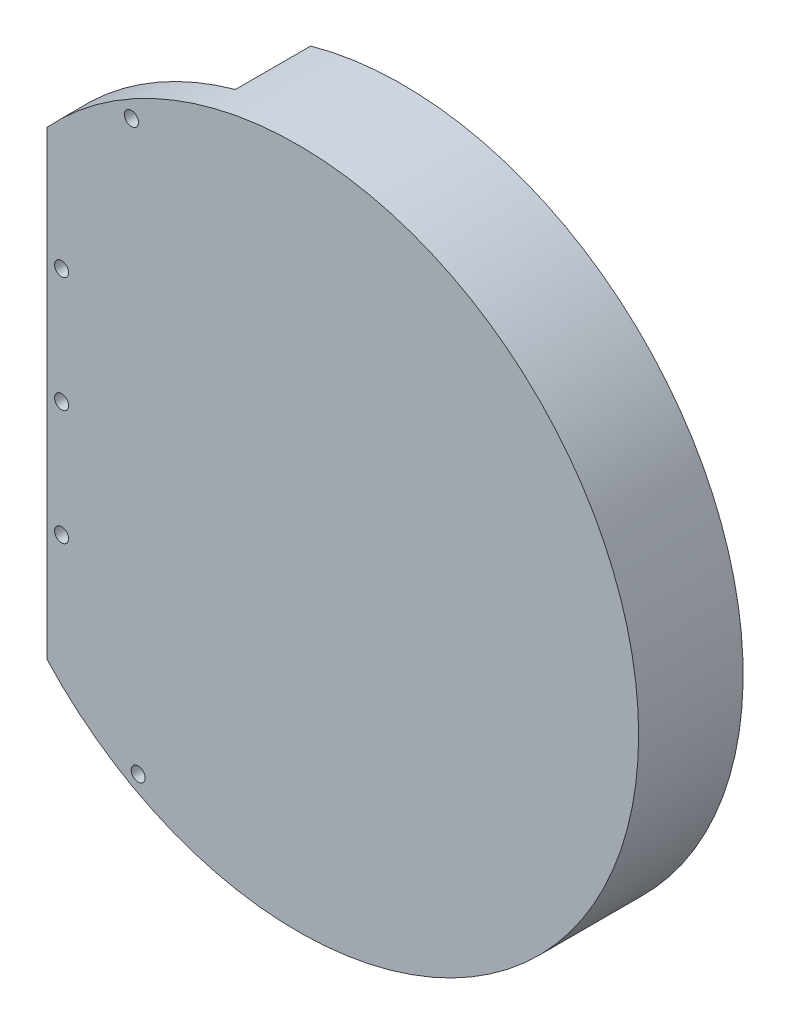
ISO-10303-21;
HEADER;
FILE_DESCRIPTION(('STEP AP214'),'2;1');
FILE_NAME('part.step','',(''),(''),'','','');
FILE_SCHEMA(('AUTOMOTIVE_DESIGN { 1 0 10303 214 1 1 1 1 }'));
ENDSEC;
DATA;
#1=APPLICATION_CONTEXT('core data for automotive mechanical design processes');
#2=APPLICATION_PROTOCOL_DEFINITION('international standard','automotive_design',2000,#1);
#3=PRODUCT_CONTEXT('',#1,'mechanical');
#4=PRODUCT('Part','Part','',(#3));
#5=PRODUCT_RELATED_PRODUCT_CATEGORY('part','',(#4));
#6=PRODUCT_DEFINITION_FORMATION('','',#4);
#7=PRODUCT_DEFINITION_CONTEXT('part definition',#1,'design');
#8=PRODUCT_DEFINITION('design','',#6,#7);
#9=PRODUCT_DEFINITION_SHAPE('','',#8);
#10=(LENGTH_UNIT() NAMED_UNIT(*) SI_UNIT(.MILLI.,.METRE.));
#11=(NAMED_UNIT(*) PLANE_ANGLE_UNIT() SI_UNIT($,.RADIAN.));
#12=(NAMED_UNIT(*) SI_UNIT($,.STERADIAN.) SOLID_ANGLE_UNIT());
#13=UNCERTAINTY_MEASURE_WITH_UNIT(LENGTH_MEASURE(1.E-05),#10,'distance_accuracy_value','');
#14=(GEOMETRIC_REPRESENTATION_CONTEXT(3) GLOBAL_UNCERTAINTY_ASSIGNED_CONTEXT((#13)) GLOBAL_UNIT_ASSIGNED_CONTEXT((#10,
#11,#12)) REPRESENTATION_CONTEXT('',''));
#15=CARTESIAN_POINT('',(0.,0.,0.));
#16=DIRECTION('',(0.,0.,1.));
#17=DIRECTION('',(1.,0.,0.));
#18=AXIS2_PLACEMENT_3D('',#15,#16,#17);
#19=CARTESIAN_POINT('',(42.9355150351706,0.,5.));
#20=DIRECTION('',(0.,0.,-1.));
#21=DIRECTION('',(-1.,0.,0.));
#22=AXIS2_PLACEMENT_3D('',#19,#20,#21);
#23=CYLINDRICAL_SURFACE('',#22,58.2854849648294);
#24=CARTESIAN_POINT('',(42.9355150351706,0.,0.));
#25=DIRECTION('',(0.,0.,1.));
#26=DIRECTION('',(-1.,0.,0.));
#27=AXIS2_PLACEMENT_3D('',#24,#25,#26);
#28=CIRCLE('',#27,58.2854849648294);
#29=CARTESIAN_POINT('',(0.,-39.4175,0.));
#30=VERTEX_POINT('',#29);
#31=CARTESIAN_POINT('',(27.955,-56.32745269286,0.));
#32=VERTEX_POINT('',#31);
#33=EDGE_CURVE('E155',#30,#32,#28,.T.);
#34=ORIENTED_EDGE('',*,*,#33,.T.);
#35=DIRECTION('',(0.,0.,1.));
#36=VECTOR('',#35,1.);
#37=CARTESIAN_POINT('',(27.955,-56.32745269286,-12.879));
#38=LINE('',#37,#36);
#39=CARTESIAN_POINT('',(27.955,-56.32745269286,-12.879));
#40=VERTEX_POINT('',#39);
#41=EDGE_CURVE('E100',#40,#32,#38,.T.);
#42=ORIENTED_EDGE('',*,*,#41,.F.);
#43=CARTESIAN_POINT('',(42.9355150351706,0.,-12.879));
#44=DIRECTION('',(0.,0.,-1.));
#45=DIRECTION('',(-1.,0.,0.));
#46=AXIS2_PLACEMENT_3D('',#43,#44,#45);
#47=CIRCLE('',#46,58.2854849648294);
#48=CARTESIAN_POINT('',(27.2366145278737,56.1314731718966,-12.879));
#49=VERTEX_POINT('',#48);
#50=EDGE_CURVE('E90',#49,#40,#47,.T.);
#51=ORIENTED_EDGE('',*,*,#50,.F.);
#52=DIRECTION('',(0.,0.,1.));
#53=VECTOR('',#52,1.);
#54=CARTESIAN_POINT('',(27.2366145278737,56.1314731718966,-12.879));
#55=LINE('',#54,#53);
#56=CARTESIAN_POINT('',(27.2366145278737,56.1314731718966,0.));
#57=VERTEX_POINT('',#56);
#58=EDGE_CURVE('E115',#49,#57,#55,.T.);
#59=ORIENTED_EDGE('',*,*,#58,.T.);
#60=CARTESIAN_POINT('',(0.,39.4175,0.));
#61=VERTEX_POINT('',#60);
#62=EDGE_CURVE('E146',#57,#61,#28,.T.);
#63=ORIENTED_EDGE('',*,*,#62,.T.);
#64=DIRECTION('',(0.,0.,-1.));
#65=VECTOR('',#64,1.);
#66=CARTESIAN_POINT('',(0.,39.4175,5.));
#67=LINE('',#66,#65);
#68=CARTESIAN_POINT('',(0.,39.4175,5.));
#69=VERTEX_POINT('',#68);
#70=EDGE_CURVE('E11',#69,#61,#67,.T.);
#71=ORIENTED_EDGE('',*,*,#70,.F.);
#72=CARTESIAN_POINT('',(42.9355150351706,0.,5.));
#73=DIRECTION('',(0.,0.,1.));
#74=DIRECTION('',(-1.,0.,0.));
#75=AXIS2_PLACEMENT_3D('',#72,#73,#74);
#76=CIRCLE('',#75,58.2854849648294);
#77=CARTESIAN_POINT('',(0.,-39.4175,5.));
#78=VERTEX_POINT('',#77);
#79=EDGE_CURVE('E149',#78,#69,#76,.T.);
#80=ORIENTED_EDGE('',*,*,#79,.F.);
#81=DIRECTION('',(0.,0.,-1.));
#82=VECTOR('',#81,1.);
#83=CARTESIAN_POINT('',(0.,-39.4175,5.));
#84=LINE('',#83,#82);
#85=EDGE_CURVE('E40',#78,#30,#84,.T.);
#86=ORIENTED_EDGE('',*,*,#85,.T.);
#87=EDGE_LOOP('',(#34,#42,#51,#59,#63,#71,#80,#86));
#88=FACE_BOUND('',#87,.T.);
#89=ADVANCED_FACE('F33',(#88),#23,.T.);
#90=CARTESIAN_POINT('',(0.,-39.4175,5.));
#91=DIRECTION('',(1.,0.,0.));
#92=DIRECTION('',(0.,1.,0.));
#93=AXIS2_PLACEMENT_3D('',#90,#91,#92);
#94=PLANE('',#93);
#95=DIRECTION('',(0.,-1.,0.));
#96=VECTOR('',#95,1.);
#97=CARTESIAN_POINT('',(0.,-39.4175,0.));
#98=LINE('',#97,#96);
#99=EDGE_CURVE('E153',#61,#30,#98,.T.);
#100=ORIENTED_EDGE('',*,*,#99,.T.);
#101=ORIENTED_EDGE('',*,*,#85,.F.);
#102=DIRECTION('',(0.,-1.,0.));
#103=VECTOR('',#102,1.);
#104=CARTESIAN_POINT('',(0.,-39.4175,5.));
#105=LINE('',#104,#103);
#106=EDGE_CURVE('E152',#69,#78,#105,.T.);
#107=ORIENTED_EDGE('',*,*,#106,.F.);
#108=ORIENTED_EDGE('',*,*,#70,.T.);
#109=EDGE_LOOP('',(#100,#101,#107,#108));
#110=FACE_BOUND('',#109,.T.);
#111=ADVANCED_FACE('F168',(#110),#94,.F.);
#112=CARTESIAN_POINT('',(42.9355150351706,0.,5.));
#113=DIRECTION('',(0.,0.,-1.));
#114=DIRECTION('',(-1.,0.,0.));
#115=AXIS2_PLACEMENT_3D('',#112,#113,#114);
#116=PLANE('',#115);
#117=CARTESIAN_POINT('',(14.4503829734086,47.941684776241,5.));
#118=DIRECTION('',(0.,0.,1.));
#119=DIRECTION('',(1.,0.,0.));
#120=AXIS2_PLACEMENT_3D('',#117,#118,#119);
#121=CIRCLE('',#120,1.20000000000001);
#122=CARTESIAN_POINT('',(15.6503829734086,47.941684776241,5.));
#123=VERTEX_POINT('',#122);
#124=EDGE_CURVE('E114',#123,#123,#121,.T.);
#125=ORIENTED_EDGE('',*,*,#124,.F.);
#126=EDGE_LOOP('',(#125));
#127=FACE_BOUND('',#126,.T.);
#128=CARTESIAN_POINT('',(15.6030670012185,-48.6104558619186,5.));
#129=DIRECTION('',(0.,0.,1.));
#130=DIRECTION('',(1.,0.,0.));
#131=AXIS2_PLACEMENT_3D('',#128,#129,#130);
#132=CIRCLE('',#131,1.2);
#133=CARTESIAN_POINT('',(16.8030670012185,-48.6104558619186,5.));
#134=VERTEX_POINT('',#133);
#135=EDGE_CURVE('E135',#134,#134,#132,.T.);
#136=ORIENTED_EDGE('',*,*,#135,.F.);
#137=EDGE_LOOP('',(#136));
#138=FACE_BOUND('',#137,.T.);
#139=CARTESIAN_POINT('',(2.5,-19.70875,5.));
#140=DIRECTION('',(0.,0.,1.));
#141=DIRECTION('',(1.,0.,0.));
#142=AXIS2_PLACEMENT_3D('',#139,#140,#141);
#143=CIRCLE('',#142,1.2);
#144=CARTESIAN_POINT('',(3.7,-19.70875,5.));
#145=VERTEX_POINT('',#144);
#146=EDGE_CURVE('E129',#145,#145,#143,.T.);
#147=ORIENTED_EDGE('',*,*,#146,.F.);
#148=EDGE_LOOP('',(#147));
#149=FACE_BOUND('',#148,.T.);
#150=CARTESIAN_POINT('',(2.5,0.,5.));
#151=DIRECTION('',(0.,0.,1.));
#152=DIRECTION('',(1.,0.,0.));
#153=AXIS2_PLACEMENT_3D('',#150,#151,#152);
#154=CIRCLE('',#153,1.2);
#155=CARTESIAN_POINT('',(3.7,0.,5.));
#156=VERTEX_POINT('',#155);
#157=EDGE_CURVE('E123',#156,#156,#154,.T.);
#158=ORIENTED_EDGE('',*,*,#157,.F.);
#159=EDGE_LOOP('',(#158));
#160=FACE_BOUND('',#159,.T.);
#161=CARTESIAN_POINT('',(2.5,19.70875,5.));
#162=DIRECTION('',(0.,0.,1.));
#163=DIRECTION('',(1.,0.,0.));
#164=AXIS2_PLACEMENT_3D('',#161,#162,#163);
#165=CIRCLE('',#164,1.2);
#166=CARTESIAN_POINT('',(3.7,19.70875,5.));
#167=VERTEX_POINT('',#166);
#168=EDGE_CURVE('E122',#167,#167,#165,.T.);
#169=ORIENTED_EDGE('',*,*,#168,.F.);
#170=EDGE_LOOP('',(#169));
#171=FACE_BOUND('',#170,.T.);
#172=ORIENTED_EDGE('',*,*,#79,.T.);
#173=ORIENTED_EDGE('',*,*,#106,.T.);
#174=EDGE_LOOP('',(#172,#173));
#175=FACE_BOUND('',#174,.T.);
#176=ADVANCED_FACE('F186',(#127,#138,#149,#160,#171,#175),#116,.F.);
#177=CARTESIAN_POINT('',(42.9355150351706,0.,0.));
#178=DIRECTION('',(0.,0.,-1.));
#179=DIRECTION('',(-1.,0.,0.));
#180=AXIS2_PLACEMENT_3D('',#177,#178,#179);
#181=PLANE('',#180);
#182=DIRECTION('',(0.,1.,0.));
#183=VECTOR('',#182,1.);
#184=CARTESIAN_POINT('',(27.955,0.,0.));
#185=LINE('',#184,#183);
#186=CARTESIAN_POINT('',(27.955,-51.1363576843139,0.));
#187=VERTEX_POINT('',#186);
#188=EDGE_CURVE('E98',#32,#187,#185,.T.);
#189=ORIENTED_EDGE('',*,*,#188,.F.);
#190=ORIENTED_EDGE('',*,*,#33,.F.);
#191=ORIENTED_EDGE('',*,*,#99,.F.);
#192=ORIENTED_EDGE('',*,*,#62,.F.);
#193=DIRECTION('',(0.304110924523192,0.952636628303599,0.));
#194=VECTOR('',#193,1.);
#195=CARTESIAN_POINT('',(12.4268108290205,9.73931713990326,0.));
#196=LINE('',#195,#194);
#197=CARTESIAN_POINT('',(25.3781791753109,50.3098684697262,0.));
#198=VERTEX_POINT('',#197);
#199=EDGE_CURVE('E52',#198,#57,#196,.T.);
#200=ORIENTED_EDGE('',*,*,#199,.F.);
#201=CARTESIAN_POINT('',(42.9355150351706,0.,0.));
#202=DIRECTION('',(0.,0.,-1.));
#203=DIRECTION('',(-1.,0.,0.));
#204=AXIS2_PLACEMENT_3D('',#201,#202,#203);
#205=CIRCLE('',#204,53.2854849648294);
#206=EDGE_CURVE('E47',#198,#187,#205,.T.);
#207=ORIENTED_EDGE('',*,*,#206,.T.);
#208=EDGE_LOOP('',(#189,#190,#191,#192,#200,#207));
#209=FACE_BOUND('',#208,.T.);
#210=CARTESIAN_POINT('',(14.4503829734086,47.941684776241,0.));
#211=DIRECTION('',(0.,0.,1.));
#212=DIRECTION('',(1.,0.,0.));
#213=AXIS2_PLACEMENT_3D('',#210,#211,#212);
#214=CIRCLE('',#213,1.20000000000001);
#215=CARTESIAN_POINT('',(15.6503829734086,47.941684776241,0.));
#216=VERTEX_POINT('',#215);
#217=EDGE_CURVE('E138',#216,#216,#214,.T.);
#218=ORIENTED_EDGE('',*,*,#217,.T.);
#219=EDGE_LOOP('',(#218));
#220=FACE_BOUND('',#219,.T.);
#221=CARTESIAN_POINT('',(15.6030670012185,-48.6104558619186,0.));
#222=DIRECTION('',(0.,0.,1.));
#223=DIRECTION('',(1.,0.,0.));
#224=AXIS2_PLACEMENT_3D('',#221,#222,#223);
#225=CIRCLE('',#224,1.2);
#226=CARTESIAN_POINT('',(16.8030670012185,-48.6104558619186,0.));
#227=VERTEX_POINT('',#226);
#228=EDGE_CURVE('E132',#227,#227,#225,.T.);
#229=ORIENTED_EDGE('',*,*,#228,.T.);
#230=EDGE_LOOP('',(#229));
#231=FACE_BOUND('',#230,.T.);
#232=CARTESIAN_POINT('',(2.5,-19.70875,0.));
#233=DIRECTION('',(0.,0.,1.));
#234=DIRECTION('',(1.,0.,0.));
#235=AXIS2_PLACEMENT_3D('',#232,#233,#234);
#236=CIRCLE('',#235,1.2);
#237=CARTESIAN_POINT('',(3.7,-19.70875,0.));
#238=VERTEX_POINT('',#237);
#239=EDGE_CURVE('E126',#238,#238,#236,.T.);
#240=ORIENTED_EDGE('',*,*,#239,.T.);
#241=EDGE_LOOP('',(#240));
#242=FACE_BOUND('',#241,.T.);
#243=CARTESIAN_POINT('',(2.5,0.,0.));
#244=DIRECTION('',(0.,0.,1.));
#245=DIRECTION('',(1.,0.,0.));
#246=AXIS2_PLACEMENT_3D('',#243,#244,#245);
#247=CIRCLE('',#246,1.2);
#248=CARTESIAN_POINT('',(3.7,0.,0.));
#249=VERTEX_POINT('',#248);
#250=EDGE_CURVE('E119',#249,#249,#247,.T.);
#251=ORIENTED_EDGE('',*,*,#250,.T.);
#252=EDGE_LOOP('',(#251));
#253=FACE_BOUND('',#252,.T.);
#254=CARTESIAN_POINT('',(2.5,19.70875,0.));
#255=DIRECTION('',(0.,0.,1.));
#256=DIRECTION('',(1.,0.,0.));
#257=AXIS2_PLACEMENT_3D('',#254,#255,#256);
#258=CIRCLE('',#257,1.2);
#259=CARTESIAN_POINT('',(3.7,19.70875,0.));
#260=VERTEX_POINT('',#259);
#261=EDGE_CURVE('E143',#260,#260,#258,.T.);
#262=ORIENTED_EDGE('',*,*,#261,.T.);
#263=EDGE_LOOP('',(#262));
#264=FACE_BOUND('',#263,.T.);
#265=ADVANCED_FACE('F166',(#209,#220,#231,#242,#253,#264),#181,.T.);
#266=CARTESIAN_POINT('',(2.5,19.70875,0.));
#267=DIRECTION('',(0.,0.,1.));
#268=DIRECTION('',(1.,0.,0.));
#269=AXIS2_PLACEMENT_3D('',#266,#267,#268);
#270=CYLINDRICAL_SURFACE('',#269,1.2);
#271=ORIENTED_EDGE('',*,*,#261,.F.);
#272=EDGE_LOOP('',(#271));
#273=FACE_BOUND('',#272,.T.);
#274=ORIENTED_EDGE('',*,*,#168,.T.);
#275=EDGE_LOOP('',(#274));
#276=FACE_BOUND('',#275,.T.);
#277=ADVANCED_FACE('F194',(#273,#276),#270,.F.);
#278=CARTESIAN_POINT('',(2.5,0.,0.));
#279=DIRECTION('',(0.,0.,1.));
#280=DIRECTION('',(1.,0.,0.));
#281=AXIS2_PLACEMENT_3D('',#278,#279,#280);
#282=CYLINDRICAL_SURFACE('',#281,1.2);
#283=ORIENTED_EDGE('',*,*,#250,.F.);
#284=EDGE_LOOP('',(#283));
#285=FACE_BOUND('',#284,.T.);
#286=ORIENTED_EDGE('',*,*,#157,.T.);
#287=EDGE_LOOP('',(#286));
#288=FACE_BOUND('',#287,.T.);
#289=ADVANCED_FACE('F198',(#285,#288),#282,.F.);
#290=CARTESIAN_POINT('',(2.5,-19.70875,0.));
#291=DIRECTION('',(0.,0.,1.));
#292=DIRECTION('',(1.,0.,0.));
#293=AXIS2_PLACEMENT_3D('',#290,#291,#292);
#294=CYLINDRICAL_SURFACE('',#293,1.2);
#295=ORIENTED_EDGE('',*,*,#239,.F.);
#296=EDGE_LOOP('',(#295));
#297=FACE_BOUND('',#296,.T.);
#298=ORIENTED_EDGE('',*,*,#146,.T.);
#299=EDGE_LOOP('',(#298));
#300=FACE_BOUND('',#299,.T.);
#301=ADVANCED_FACE('F206',(#297,#300),#294,.F.);
#302=CARTESIAN_POINT('',(15.6030670012185,-48.6104558619186,0.));
#303=DIRECTION('',(0.,0.,1.));
#304=DIRECTION('',(1.,0.,0.));
#305=AXIS2_PLACEMENT_3D('',#302,#303,#304);
#306=CYLINDRICAL_SURFACE('',#305,1.2);
#307=ORIENTED_EDGE('',*,*,#228,.F.);
#308=EDGE_LOOP('',(#307));
#309=FACE_BOUND('',#308,.T.);
#310=ORIENTED_EDGE('',*,*,#135,.T.);
#311=EDGE_LOOP('',(#310));
#312=FACE_BOUND('',#311,.T.);
#313=ADVANCED_FACE('F202',(#309,#312),#306,.F.);
#314=CARTESIAN_POINT('',(14.4503829734086,47.941684776241,0.));
#315=DIRECTION('',(0.,0.,1.));
#316=DIRECTION('',(1.,0.,0.));
#317=AXIS2_PLACEMENT_3D('',#314,#315,#316);
#318=CYLINDRICAL_SURFACE('',#317,1.20000000000001);
#319=ORIENTED_EDGE('',*,*,#217,.F.);
#320=EDGE_LOOP('',(#319));
#321=FACE_BOUND('',#320,.T.);
#322=ORIENTED_EDGE('',*,*,#124,.T.);
#323=EDGE_LOOP('',(#322));
#324=FACE_BOUND('',#323,.T.);
#325=ADVANCED_FACE('F179',(#321,#324),#318,.F.);
#326=CARTESIAN_POINT('',(42.9355150351706,0.,-12.879));
#327=DIRECTION('',(0.,0.,1.));
#328=DIRECTION('',(1.,0.,0.));
#329=AXIS2_PLACEMENT_3D('',#326,#327,#328);
#330=CYLINDRICAL_SURFACE('',#329,53.2854849648294);
#331=ORIENTED_EDGE('',*,*,#206,.F.);
#332=DIRECTION('',(0.,0.,1.));
#333=VECTOR('',#332,1.);
#334=CARTESIAN_POINT('',(25.3781791753109,50.3098684697262,-12.879));
#335=LINE('',#334,#333);
#336=CARTESIAN_POINT('',(25.3781791753109,50.3098684697262,-12.879));
#337=VERTEX_POINT('',#336);
#338=EDGE_CURVE('E104',#337,#198,#335,.T.);
#339=ORIENTED_EDGE('',*,*,#338,.F.);
#340=CARTESIAN_POINT('',(42.9355150351706,0.,-12.879));
#341=DIRECTION('',(0.,0.,-1.));
#342=DIRECTION('',(-1.,0.,0.));
#343=AXIS2_PLACEMENT_3D('',#340,#341,#342);
#344=CIRCLE('',#343,53.2854849648294);
#345=CARTESIAN_POINT('',(27.955,-51.1363576843139,-12.879));
#346=VERTEX_POINT('',#345);
#347=EDGE_CURVE('E88',#337,#346,#344,.T.);
#348=ORIENTED_EDGE('',*,*,#347,.T.);
#349=DIRECTION('',(0.,0.,1.));
#350=VECTOR('',#349,1.);
#351=CARTESIAN_POINT('',(27.955,-51.1363576843139,-12.879));
#352=LINE('',#351,#350);
#353=EDGE_CURVE('E96',#346,#187,#352,.T.);
#354=ORIENTED_EDGE('',*,*,#353,.T.);
#355=EDGE_LOOP('',(#331,#339,#348,#354));
#356=FACE_BOUND('',#355,.T.);
#357=ADVANCED_FACE('F103',(#356),#330,.F.);
#358=CARTESIAN_POINT('',(12.4268108290205,9.73931713990326,-12.879));
#359=DIRECTION('',(0.952636628303599,-0.304110924523191,0.));
#360=DIRECTION('',(0.304110924523191,0.952636628303599,0.));
#361=AXIS2_PLACEMENT_3D('',#358,#359,#360);
#362=PLANE('',#361);
#363=ORIENTED_EDGE('',*,*,#199,.T.);
#364=ORIENTED_EDGE('',*,*,#58,.F.);
#365=DIRECTION('',(0.304110924523192,0.952636628303599,0.));
#366=VECTOR('',#365,1.);
#367=CARTESIAN_POINT('',(12.4268108290205,9.73931713990326,-12.879));
#368=LINE('',#367,#366);
#369=EDGE_CURVE('E101',#337,#49,#368,.T.);
#370=ORIENTED_EDGE('',*,*,#369,.F.);
#371=ORIENTED_EDGE('',*,*,#338,.T.);
#372=EDGE_LOOP('',(#363,#364,#370,#371));
#373=FACE_BOUND('',#372,.T.);
#374=ADVANCED_FACE('F171',(#373),#362,.F.);
#375=CARTESIAN_POINT('',(27.955,0.,-12.879));
#376=DIRECTION('',(1.,0.,0.));
#377=DIRECTION('',(0.,0.,-1.));
#378=AXIS2_PLACEMENT_3D('',#375,#376,#377);
#379=PLANE('',#378);
#380=ORIENTED_EDGE('',*,*,#188,.T.);
#381=ORIENTED_EDGE('',*,*,#353,.F.);
#382=DIRECTION('',(0.,1.,0.));
#383=VECTOR('',#382,1.);
#384=CARTESIAN_POINT('',(27.955,0.,-12.879));
#385=LINE('',#384,#383);
#386=EDGE_CURVE('E84',#40,#346,#385,.T.);
#387=ORIENTED_EDGE('',*,*,#386,.F.);
#388=ORIENTED_EDGE('',*,*,#41,.T.);
#389=EDGE_LOOP('',(#380,#381,#387,#388));
#390=FACE_BOUND('',#389,.T.);
#391=ADVANCED_FACE('F97',(#390),#379,.F.);
#392=CARTESIAN_POINT('',(42.9355150351706,0.,-12.879));
#393=DIRECTION('',(0.,0.,-1.));
#394=DIRECTION('',(-1.,0.,0.));
#395=AXIS2_PLACEMENT_3D('',#392,#393,#394);
#396=PLANE('',#395);
#397=ORIENTED_EDGE('',*,*,#347,.F.);
#398=ORIENTED_EDGE('',*,*,#369,.T.);
#399=ORIENTED_EDGE('',*,*,#50,.T.);
#400=ORIENTED_EDGE('',*,*,#386,.T.);
#401=EDGE_LOOP('',(#397,#398,#399,#400));
#402=FACE_BOUND('',#401,.T.);
#403=ADVANCED_FACE('F86',(#402),#396,.T.);
#404=CLOSED_SHELL('',(#89,#111,#176,#265,#277,#289,#301,#313,#325,#357,#374,#391,#403));
#405=MANIFOLD_SOLID_BREP('B2',#404);
#406=ADVANCED_BREP_SHAPE_REPRESENTATION('',(#18,#405),#14);
#407=SHAPE_DEFINITION_REPRESENTATION(#9,#406);
ENDSEC;
END-ISO-10303-21;
